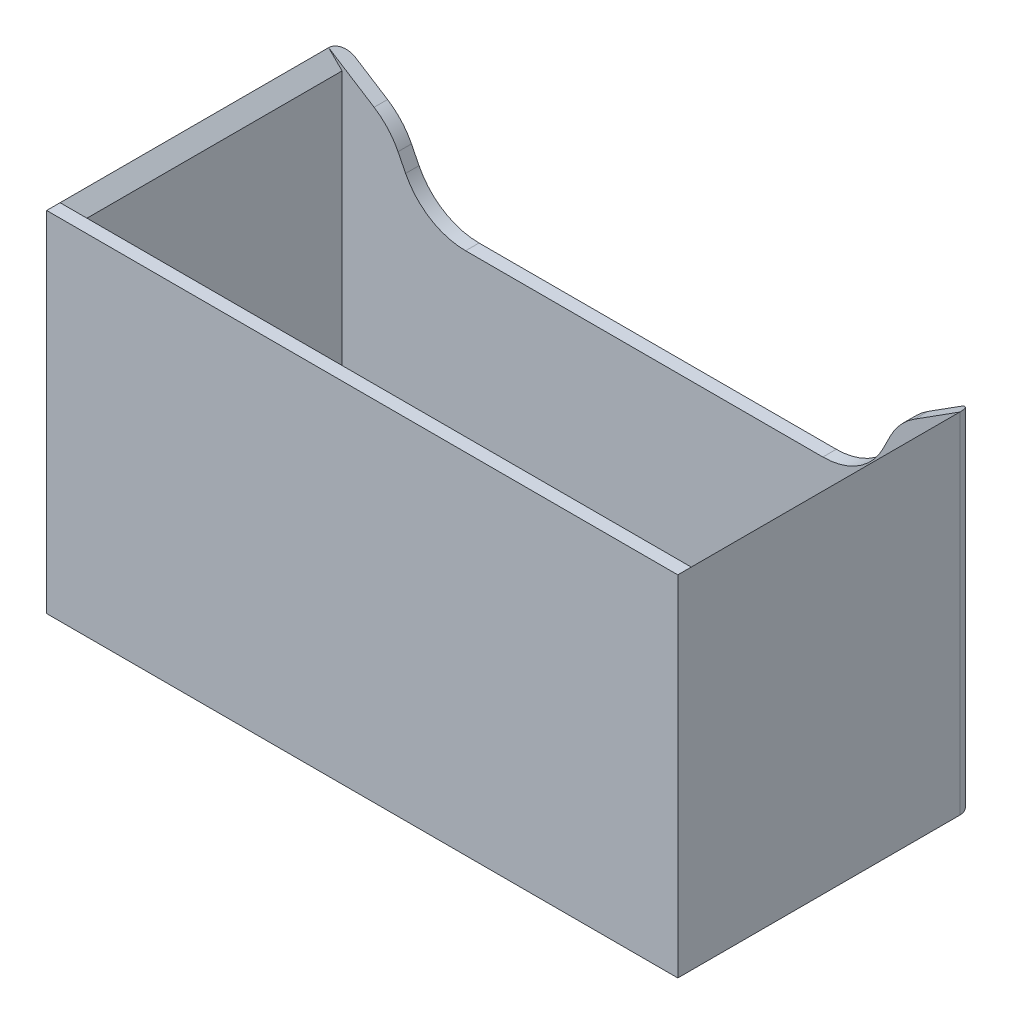
ISO-10303-21;
HEADER;
FILE_DESCRIPTION(('STEP AP214'),'2;1');
FILE_NAME('part.step','',(''),(''),'','','');
FILE_SCHEMA(('AUTOMOTIVE_DESIGN { 1 0 10303 214 1 1 1 1 }'));
ENDSEC;
DATA;
#1=APPLICATION_CONTEXT('core data for automotive mechanical design processes');
#2=APPLICATION_PROTOCOL_DEFINITION('international standard','automotive_design',2000,#1);
#3=PRODUCT_CONTEXT('',#1,'mechanical');
#4=PRODUCT('Part','Part','',(#3));
#5=PRODUCT_RELATED_PRODUCT_CATEGORY('part','',(#4));
#6=PRODUCT_DEFINITION_FORMATION('','',#4);
#7=PRODUCT_DEFINITION_CONTEXT('part definition',#1,'design');
#8=PRODUCT_DEFINITION('design','',#6,#7);
#9=PRODUCT_DEFINITION_SHAPE('','',#8);
#10=(LENGTH_UNIT() NAMED_UNIT(*) SI_UNIT(.MILLI.,.METRE.));
#11=(NAMED_UNIT(*) PLANE_ANGLE_UNIT() SI_UNIT($,.RADIAN.));
#12=(NAMED_UNIT(*) SI_UNIT($,.STERADIAN.) SOLID_ANGLE_UNIT());
#13=UNCERTAINTY_MEASURE_WITH_UNIT(LENGTH_MEASURE(1.E-05),#10,'distance_accuracy_value','');
#14=(GEOMETRIC_REPRESENTATION_CONTEXT(3) GLOBAL_UNCERTAINTY_ASSIGNED_CONTEXT((#13)) GLOBAL_UNIT_ASSIGNED_CONTEXT((#10,
#11,#12)) REPRESENTATION_CONTEXT('',''));
#15=CARTESIAN_POINT('',(0.,0.,0.));
#16=DIRECTION('',(0.,0.,1.));
#17=DIRECTION('',(1.,0.,0.));
#18=AXIS2_PLACEMENT_3D('',#15,#16,#17);
#19=CARTESIAN_POINT('',(22.5,25.,-10.));
#20=DIRECTION('',(0.,-1.,0.));
#21=DIRECTION('',(0.,0.,-1.));
#22=AXIS2_PLACEMENT_3D('',#19,#20,#21);
#23=CYLINDRICAL_SURFACE('',#22,1.);
#24=DIRECTION('',(0.,-1.,0.));
#25=VECTOR('',#24,1.);
#26=CARTESIAN_POINT('',(22.5,25.,-11.));
#27=LINE('',#26,#25);
#28=CARTESIAN_POINT('',(22.5,24.3637077150299,-11.));
#29=VERTEX_POINT('',#28);
#30=CARTESIAN_POINT('',(22.5,-1.,-11.));
#31=VERTEX_POINT('',#30);
#32=EDGE_CURVE('E294',#29,#31,#27,.T.);
#33=ORIENTED_EDGE('',*,*,#32,.F.);
#34=CARTESIAN_POINT('',(22.5,24.3637077150299,-10.));
#35=DIRECTION('',(-0.536832644426927,0.843688752963789,0.));
#36=DIRECTION('',(-0.843688752963789,-0.536832644426927,0.));
#37=AXIS2_PLACEMENT_3D('',#34,#35,#36);
#38=ELLIPSE('',#37,1.18527122293275,1.);
#39=CARTESIAN_POINT('',(23.5,25.,-10.));
#40=VERTEX_POINT('',#39);
#41=EDGE_CURVE('E309',#29,#40,#38,.F.);
#42=ORIENTED_EDGE('',*,*,#41,.T.);
#43=DIRECTION('',(0.,-1.,0.));
#44=VECTOR('',#43,1.);
#45=CARTESIAN_POINT('',(23.5,25.,-10.));
#46=LINE('',#45,#44);
#47=CARTESIAN_POINT('',(23.5,-1.,-10.));
#48=VERTEX_POINT('',#47);
#49=EDGE_CURVE('E300',#48,#40,#46,.F.);
#50=ORIENTED_EDGE('',*,*,#49,.F.);
#51=CARTESIAN_POINT('',(22.5,-1.,-10.));
#52=DIRECTION('',(0.,-1.,0.));
#53=DIRECTION('',(0.,0.,-1.));
#54=AXIS2_PLACEMENT_3D('',#51,#52,#53);
#55=CIRCLE('',#54,1.);
#56=EDGE_CURVE('E298',#31,#48,#55,.T.);
#57=ORIENTED_EDGE('',*,*,#56,.F.);
#58=EDGE_LOOP('',(#33,#42,#50,#57));
#59=FACE_BOUND('',#58,.T.);
#60=ADVANCED_FACE('F35',(#59),#23,.T.);
#61=CARTESIAN_POINT('',(0.,25.,0.));
#62=DIRECTION('',(0.,-1.,0.));
#63=DIRECTION('',(0.,0.,-1.));
#64=AXIS2_PLACEMENT_3D('',#61,#62,#63);
#65=PLANE('',#64);
#66=DIRECTION('',(0.,0.,-1.));
#67=VECTOR('',#66,1.);
#68=CARTESIAN_POINT('',(23.5,25.,0.));
#69=LINE('',#68,#67);
#70=CARTESIAN_POINT('',(23.5,25.,11.));
#71=VERTEX_POINT('',#70);
#72=CARTESIAN_POINT('',(23.5,25.,10.));
#73=VERTEX_POINT('',#72);
#74=EDGE_CURVE('E284',#71,#73,#69,.T.);
#75=ORIENTED_EDGE('',*,*,#74,.T.);
#76=DIRECTION('',(1.,0.,0.));
#77=VECTOR('',#76,1.);
#78=CARTESIAN_POINT('',(-22.5,25.,10.));
#79=LINE('',#78,#77);
#80=CARTESIAN_POINT('',(-23.5,25.,10.));
#81=VERTEX_POINT('',#80);
#82=EDGE_CURVE('E49',#81,#73,#79,.T.);
#83=ORIENTED_EDGE('',*,*,#82,.F.);
#84=DIRECTION('',(0.,0.,1.));
#85=VECTOR('',#84,1.);
#86=CARTESIAN_POINT('',(-23.5,25.,0.));
#87=LINE('',#86,#85);
#88=CARTESIAN_POINT('',(-23.5,25.,11.));
#89=VERTEX_POINT('',#88);
#90=EDGE_CURVE('E287',#81,#89,#87,.T.);
#91=ORIENTED_EDGE('',*,*,#90,.T.);
#92=DIRECTION('',(1.,0.,0.));
#93=VECTOR('',#92,1.);
#94=CARTESIAN_POINT('',(0.,25.,11.));
#95=LINE('',#94,#93);
#96=EDGE_CURVE('E273',#89,#71,#95,.T.);
#97=ORIENTED_EDGE('',*,*,#96,.T.);
#98=EDGE_LOOP('',(#75,#83,#91,#97));
#99=FACE_BOUND('',#98,.T.);
#100=ADVANCED_FACE('F376',(#99),#65,.F.);
#101=CARTESIAN_POINT('',(23.5,25.,10.));
#102=DIRECTION('',(-1.,0.,0.));
#103=DIRECTION('',(0.,0.,1.));
#104=AXIS2_PLACEMENT_3D('',#101,#102,#103);
#105=PLANE('',#104);
#106=DIRECTION('',(0.,0.,-1.));
#107=VECTOR('',#106,1.);
#108=CARTESIAN_POINT('',(23.5,-1.,0.));
#109=LINE('',#108,#107);
#110=CARTESIAN_POINT('',(23.5,-1.,11.));
#111=VERTEX_POINT('',#110);
#112=EDGE_CURVE('E265',#111,#48,#109,.T.);
#113=ORIENTED_EDGE('',*,*,#112,.T.);
#114=ORIENTED_EDGE('',*,*,#49,.T.);
#115=EDGE_CURVE('E283',#73,#40,#69,.T.);
#116=ORIENTED_EDGE('',*,*,#115,.F.);
#117=ORIENTED_EDGE('',*,*,#74,.F.);
#118=DIRECTION('',(0.,-1.,0.));
#119=VECTOR('',#118,1.);
#120=CARTESIAN_POINT('',(23.5,25.,11.));
#121=LINE('',#120,#119);
#122=EDGE_CURVE('E269',#71,#111,#121,.T.);
#123=ORIENTED_EDGE('',*,*,#122,.T.);
#124=EDGE_LOOP('',(#113,#114,#116,#117,#123));
#125=FACE_BOUND('',#124,.T.);
#126=ADVANCED_FACE('F332',(#125),#105,.F.);
#127=CARTESIAN_POINT('',(-22.5,25.,-11.));
#128=DIRECTION('',(0.,0.,1.));
#129=DIRECTION('',(1.,0.,0.));
#130=AXIS2_PLACEMENT_3D('',#127,#128,#129);
#131=PLANE('',#130);
#132=DIRECTION('',(0.,-1.,0.));
#133=VECTOR('',#132,1.);
#134=CARTESIAN_POINT('',(-22.5,25.,-11.));
#135=LINE('',#134,#133);
#136=CARTESIAN_POINT('',(-22.5,-1.,-11.));
#137=VERTEX_POINT('',#136);
#138=CARTESIAN_POINT('',(-22.5,24.3637077150299,-11.));
#139=VERTEX_POINT('',#138);
#140=EDGE_CURVE('E281',#137,#139,#135,.F.);
#141=ORIENTED_EDGE('',*,*,#140,.T.);
#142=DIRECTION('',(0.843688752963789,-0.536832644426927,0.));
#143=VECTOR('',#142,1.);
#144=CARTESIAN_POINT('',(-22.7881892881224,24.5470803356732,-11.));
#145=LINE('',#144,#143);
#146=CARTESIAN_POINT('',(-20.1152547441115,22.8463127070889,-11.));
#147=VERTEX_POINT('',#146);
#148=EDGE_CURVE('E210',#139,#147,#145,.T.);
#149=ORIENTED_EDGE('',*,*,#148,.T.);
#150=CARTESIAN_POINT('',(-22.7994179662461,18.6278689422699,-11.));
#151=DIRECTION('',(0.,0.,1.));
#152=DIRECTION('',(1.,0.,0.));
#153=AXIS2_PLACEMENT_3D('',#150,#151,#152);
#154=CIRCLE('',#153,5.);
#155=CARTESIAN_POINT('',(-18.3325676005108,20.8744770100312,-11.));
#156=VERTEX_POINT('',#155);
#157=EDGE_CURVE('E230',#147,#156,#154,.F.);
#158=ORIENTED_EDGE('',*,*,#157,.T.);
#159=DIRECTION('',(0.449321613552262,-0.893370073147065,0.));
#160=VECTOR('',#159,1.);
#161=CARTESIAN_POINT('',(-20.8299583376628,25.8399495763021,-11.));
#162=LINE('',#161,#160);
#163=CARTESIAN_POINT('',(-17.7687164359999,19.7533919322387,-11.));
#164=VERTEX_POINT('',#163);
#165=EDGE_CURVE('E233',#156,#164,#162,.T.);
#166=ORIENTED_EDGE('',*,*,#165,.T.);
#167=CARTESIAN_POINT('',(-13.3018660702646,22.,-11.));
#168=DIRECTION('',(0.,0.,1.));
#169=DIRECTION('',(1.,0.,0.));
#170=AXIS2_PLACEMENT_3D('',#167,#168,#169);
#171=CIRCLE('',#170,5.);
#172=CARTESIAN_POINT('',(-13.3018660702646,17.,-11.));
#173=VERTEX_POINT('',#172);
#174=EDGE_CURVE('E236',#164,#173,#171,.T.);
#175=ORIENTED_EDGE('',*,*,#174,.T.);
#176=DIRECTION('',(1.,0.,0.));
#177=VECTOR('',#176,1.);
#178=CARTESIAN_POINT('',(-22.5,17.,-11.));
#179=LINE('',#178,#177);
#180=CARTESIAN_POINT('',(13.3018660702646,17.,-11.));
#181=VERTEX_POINT('',#180);
#182=EDGE_CURVE('E239',#173,#181,#179,.T.);
#183=ORIENTED_EDGE('',*,*,#182,.T.);
#184=CARTESIAN_POINT('',(13.3018660702646,22.,-11.));
#185=DIRECTION('',(0.,0.,1.));
#186=DIRECTION('',(1.,0.,0.));
#187=AXIS2_PLACEMENT_3D('',#184,#185,#186);
#188=CIRCLE('',#187,5.);
#189=CARTESIAN_POINT('',(17.768716436,19.7533919322387,-11.));
#190=VERTEX_POINT('',#189);
#191=EDGE_CURVE('E242',#190,#181,#188,.F.);
#192=ORIENTED_EDGE('',*,*,#191,.F.);
#193=DIRECTION('',(-0.449321613552262,-0.893370073147065,0.));
#194=VECTOR('',#193,1.);
#195=CARTESIAN_POINT('',(11.7449122794284,7.77647785184372,-11.));
#196=LINE('',#195,#194);
#197=CARTESIAN_POINT('',(18.3325676005108,20.8744770100312,-11.));
#198=VERTEX_POINT('',#197);
#199=EDGE_CURVE('E173',#198,#190,#196,.T.);
#200=ORIENTED_EDGE('',*,*,#199,.F.);
#201=CARTESIAN_POINT('',(22.7994179662461,18.6278689422699,-11.));
#202=DIRECTION('',(0.,0.,1.));
#203=DIRECTION('',(1.,0.,0.));
#204=AXIS2_PLACEMENT_3D('',#201,#202,#203);
#205=CIRCLE('',#204,5.);
#206=CARTESIAN_POINT('',(20.1152547441115,22.8463127070889,-11.));
#207=VERTEX_POINT('',#206);
#208=EDGE_CURVE('E228',#207,#198,#205,.T.);
#209=ORIENTED_EDGE('',*,*,#208,.F.);
#210=DIRECTION('',(-0.843688752963789,-0.536832644426927,0.));
#211=VECTOR('',#210,1.);
#212=CARTESIAN_POINT('',(-9.24329274636927,4.16569544096689,-11.));
#213=LINE('',#212,#211);
#214=EDGE_CURVE('E225',#29,#207,#213,.T.);
#215=ORIENTED_EDGE('',*,*,#214,.F.);
#216=ORIENTED_EDGE('',*,*,#32,.T.);
#217=DIRECTION('',(-1.,0.,0.));
#218=VECTOR('',#217,1.);
#219=CARTESIAN_POINT('',(0.,-1.,-11.));
#220=LINE('',#219,#218);
#221=EDGE_CURVE('E268',#31,#137,#220,.T.);
#222=ORIENTED_EDGE('',*,*,#221,.T.);
#223=EDGE_LOOP('',(#141,#149,#158,#166,#175,#183,#192,#200,#209,#215,#216,#222));
#224=FACE_BOUND('',#223,.T.);
#225=ADVANCED_FACE('F369',(#224),#131,.F.);
#226=CARTESIAN_POINT('',(-23.5,25.,10.));
#227=DIRECTION('',(1.,0.,0.));
#228=DIRECTION('',(0.,0.,-1.));
#229=AXIS2_PLACEMENT_3D('',#226,#227,#228);
#230=PLANE('',#229);
#231=CARTESIAN_POINT('',(-23.5,25.,-10.));
#232=VERTEX_POINT('',#231);
#233=EDGE_CURVE('E288',#232,#81,#87,.T.);
#234=ORIENTED_EDGE('',*,*,#233,.F.);
#235=DIRECTION('',(0.,-1.,0.));
#236=VECTOR('',#235,1.);
#237=CARTESIAN_POINT('',(-23.5,25.,-10.));
#238=LINE('',#237,#236);
#239=CARTESIAN_POINT('',(-23.5,-1.,-10.));
#240=VERTEX_POINT('',#239);
#241=EDGE_CURVE('E303',#232,#240,#238,.T.);
#242=ORIENTED_EDGE('',*,*,#241,.T.);
#243=DIRECTION('',(0.,0.,1.));
#244=VECTOR('',#243,1.);
#245=CARTESIAN_POINT('',(-23.5,-1.,0.));
#246=LINE('',#245,#244);
#247=CARTESIAN_POINT('',(-23.5,-1.,11.));
#248=VERTEX_POINT('',#247);
#249=EDGE_CURVE('E276',#240,#248,#246,.T.);
#250=ORIENTED_EDGE('',*,*,#249,.T.);
#251=DIRECTION('',(0.,-1.,0.));
#252=VECTOR('',#251,1.);
#253=CARTESIAN_POINT('',(-23.5,25.,11.));
#254=LINE('',#253,#252);
#255=EDGE_CURVE('E272',#89,#248,#254,.T.);
#256=ORIENTED_EDGE('',*,*,#255,.F.);
#257=ORIENTED_EDGE('',*,*,#90,.F.);
#258=EDGE_LOOP('',(#234,#242,#250,#256,#257));
#259=FACE_BOUND('',#258,.T.);
#260=ADVANCED_FACE('F357',(#259),#230,.F.);
#261=CARTESIAN_POINT('',(-22.5,25.,11.));
#262=DIRECTION('',(0.,0.,-1.));
#263=DIRECTION('',(-1.,0.,0.));
#264=AXIS2_PLACEMENT_3D('',#261,#262,#263);
#265=PLANE('',#264);
#266=DIRECTION('',(1.,0.,0.));
#267=VECTOR('',#266,1.);
#268=CARTESIAN_POINT('',(0.,-1.,11.));
#269=LINE('',#268,#267);
#270=EDGE_CURVE('E278',#248,#111,#269,.T.);
#271=ORIENTED_EDGE('',*,*,#270,.T.);
#272=ORIENTED_EDGE('',*,*,#122,.F.);
#273=ORIENTED_EDGE('',*,*,#96,.F.);
#274=ORIENTED_EDGE('',*,*,#255,.T.);
#275=EDGE_LOOP('',(#271,#272,#273,#274));
#276=FACE_BOUND('',#275,.T.);
#277=ADVANCED_FACE('F373',(#276),#265,.F.);
#278=CARTESIAN_POINT('',(0.,-1.,0.));
#279=DIRECTION('',(0.,-1.,0.));
#280=DIRECTION('',(0.,0.,-1.));
#281=AXIS2_PLACEMENT_3D('',#278,#279,#280);
#282=PLANE('',#281);
#283=ORIENTED_EDGE('',*,*,#221,.F.);
#284=ORIENTED_EDGE('',*,*,#56,.T.);
#285=ORIENTED_EDGE('',*,*,#112,.F.);
#286=ORIENTED_EDGE('',*,*,#270,.F.);
#287=ORIENTED_EDGE('',*,*,#249,.F.);
#288=CARTESIAN_POINT('',(-22.5,-1.,-10.));
#289=DIRECTION('',(0.,-1.,0.));
#290=DIRECTION('',(0.,0.,-1.));
#291=AXIS2_PLACEMENT_3D('',#288,#289,#290);
#292=CIRCLE('',#291,1.);
#293=EDGE_CURVE('E296',#240,#137,#292,.T.);
#294=ORIENTED_EDGE('',*,*,#293,.T.);
#295=EDGE_LOOP('',(#283,#284,#285,#286,#287,#294));
#296=FACE_BOUND('',#295,.T.);
#297=ADVANCED_FACE('F366',(#296),#282,.T.);
#298=CARTESIAN_POINT('',(22.5,25.,10.));
#299=DIRECTION('',(-1.,0.,0.));
#300=DIRECTION('',(0.,0.,1.));
#301=AXIS2_PLACEMENT_3D('',#298,#299,#300);
#302=PLANE('',#301);
#303=DIRECTION('',(0.,-1.,0.));
#304=VECTOR('',#303,1.);
#305=CARTESIAN_POINT('',(22.5,25.,10.));
#306=LINE('',#305,#304);
#307=CARTESIAN_POINT('',(22.5,24.,10.));
#308=VERTEX_POINT('',#307);
#309=CARTESIAN_POINT('',(22.5,0.,10.));
#310=VERTEX_POINT('',#309);
#311=EDGE_CURVE('E246',#308,#310,#306,.T.);
#312=ORIENTED_EDGE('',*,*,#311,.F.);
#313=DIRECTION('',(0.,0.,-1.));
#314=VECTOR('',#313,1.);
#315=CARTESIAN_POINT('',(22.5,24.,-10.));
#316=LINE('',#315,#314);
#317=CARTESIAN_POINT('',(22.5,24.,-10.));
#318=VERTEX_POINT('',#317);
#319=EDGE_CURVE('E319',#308,#318,#316,.T.);
#320=ORIENTED_EDGE('',*,*,#319,.T.);
#321=DIRECTION('',(0.,-1.,0.));
#322=VECTOR('',#321,1.);
#323=CARTESIAN_POINT('',(22.5,25.,-10.));
#324=LINE('',#323,#322);
#325=CARTESIAN_POINT('',(22.5,0.,-10.));
#326=VERTEX_POINT('',#325);
#327=EDGE_CURVE('E263',#318,#326,#324,.T.);
#328=ORIENTED_EDGE('',*,*,#327,.T.);
#329=DIRECTION('',(0.,0.,-1.));
#330=VECTOR('',#329,1.);
#331=CARTESIAN_POINT('',(22.5,0.,10.));
#332=LINE('',#331,#330);
#333=EDGE_CURVE('E244',#310,#326,#332,.T.);
#334=ORIENTED_EDGE('',*,*,#333,.F.);
#335=EDGE_LOOP('',(#312,#320,#328,#334));
#336=FACE_BOUND('',#335,.T.);
#337=ADVANCED_FACE('F341',(#336),#302,.T.);
#338=CARTESIAN_POINT('',(-22.5,25.,-10.));
#339=DIRECTION('',(0.,0.,1.));
#340=DIRECTION('',(1.,0.,0.));
#341=AXIS2_PLACEMENT_3D('',#338,#339,#340);
#342=PLANE('',#341);
#343=DIRECTION('',(0.843688752963789,-0.536832644426927,0.));
#344=VECTOR('',#343,1.);
#345=CARTESIAN_POINT('',(4.55054333729361,7.15165568525987,-10.));
#346=LINE('',#345,#344);
#347=CARTESIAN_POINT('',(-20.1152547441115,22.8463127070889,-10.));
#348=VERTEX_POINT('',#347);
#349=EDGE_CURVE('E196',#232,#348,#346,.T.);
#350=ORIENTED_EDGE('',*,*,#349,.F.);
#351=DIRECTION('',(0.70710678118655,-0.707106781186545,0.));
#352=VECTOR('',#351,1.);
#353=CARTESIAN_POINT('',(-22.5,24.,-10.));
#354=LINE('',#353,#352);
#355=CARTESIAN_POINT('',(-22.5,24.,-10.));
#356=VERTEX_POINT('',#355);
#357=EDGE_CURVE('E317',#232,#356,#354,.T.);
#358=ORIENTED_EDGE('',*,*,#357,.T.);
#359=DIRECTION('',(0.,-1.,0.));
#360=VECTOR('',#359,1.);
#361=CARTESIAN_POINT('',(-22.5,25.,-10.));
#362=LINE('',#361,#360);
#363=CARTESIAN_POINT('',(-22.5,0.,-10.));
#364=VERTEX_POINT('',#363);
#365=EDGE_CURVE('E261',#356,#364,#362,.T.);
#366=ORIENTED_EDGE('',*,*,#365,.T.);
#367=DIRECTION('',(-1.,0.,0.));
#368=VECTOR('',#367,1.);
#369=CARTESIAN_POINT('',(-22.5,0.,-10.));
#370=LINE('',#369,#368);
#371=EDGE_CURVE('E250',#326,#364,#370,.T.);
#372=ORIENTED_EDGE('',*,*,#371,.F.);
#373=ORIENTED_EDGE('',*,*,#327,.F.);
#374=DIRECTION('',(0.70710678118655,0.707106781186545,0.));
#375=VECTOR('',#374,1.);
#376=CARTESIAN_POINT('',(22.5,24.,-10.));
#377=LINE('',#376,#375);
#378=EDGE_CURVE('E43',#318,#40,#377,.T.);
#379=ORIENTED_EDGE('',*,*,#378,.T.);
#380=DIRECTION('',(-0.843688752963789,-0.536832644426927,0.));
#381=VECTOR('',#380,1.);
#382=CARTESIAN_POINT('',(-4.5505433372936,7.15165568525986,-10.));
#383=LINE('',#382,#381);
#384=CARTESIAN_POINT('',(20.1152547441115,22.8463127070889,-10.));
#385=VERTEX_POINT('',#384);
#386=EDGE_CURVE('E192',#40,#385,#383,.T.);
#387=ORIENTED_EDGE('',*,*,#386,.T.);
#388=CARTESIAN_POINT('',(22.7994179662461,18.6278689422699,-10.));
#389=DIRECTION('',(0.,0.,1.));
#390=DIRECTION('',(1.,0.,0.));
#391=AXIS2_PLACEMENT_3D('',#388,#389,#390);
#392=CIRCLE('',#391,5.);
#393=CARTESIAN_POINT('',(18.3325676005108,20.8744770100312,-10.));
#394=VERTEX_POINT('',#393);
#395=EDGE_CURVE('E190',#385,#394,#392,.T.);
#396=ORIENTED_EDGE('',*,*,#395,.T.);
#397=DIRECTION('',(-0.449321613552262,-0.893370073147065,0.));
#398=VECTOR('',#397,1.);
#399=CARTESIAN_POINT('',(6.25217323940208,-3.14453847579688,-10.));
#400=LINE('',#399,#398);
#401=CARTESIAN_POINT('',(17.768716436,19.7533919322387,-10.));
#402=VERTEX_POINT('',#401);
#403=EDGE_CURVE('E170',#394,#402,#400,.T.);
#404=ORIENTED_EDGE('',*,*,#403,.T.);
#405=CARTESIAN_POINT('',(13.3018660702646,22.,-10.));
#406=DIRECTION('',(0.,0.,1.));
#407=DIRECTION('',(1.,0.,0.));
#408=AXIS2_PLACEMENT_3D('',#405,#406,#407);
#409=CIRCLE('',#408,5.);
#410=CARTESIAN_POINT('',(13.3018660702646,17.,-10.));
#411=VERTEX_POINT('',#410);
#412=EDGE_CURVE('E180',#402,#411,#409,.F.);
#413=ORIENTED_EDGE('',*,*,#412,.T.);
#414=DIRECTION('',(1.,0.,0.));
#415=VECTOR('',#414,1.);
#416=CARTESIAN_POINT('',(0.,17.,-10.));
#417=LINE('',#416,#415);
#418=CARTESIAN_POINT('',(-13.3018660702646,17.,-10.));
#419=VERTEX_POINT('',#418);
#420=EDGE_CURVE('E177',#419,#411,#417,.T.);
#421=ORIENTED_EDGE('',*,*,#420,.F.);
#422=CARTESIAN_POINT('',(-13.3018660702646,22.,-10.));
#423=DIRECTION('',(0.,0.,1.));
#424=DIRECTION('',(1.,0.,0.));
#425=AXIS2_PLACEMENT_3D('',#422,#423,#424);
#426=CIRCLE('',#425,5.);
#427=CARTESIAN_POINT('',(-17.7687164359999,19.7533919322387,-10.));
#428=VERTEX_POINT('',#427);
#429=EDGE_CURVE('E205',#428,#419,#426,.T.);
#430=ORIENTED_EDGE('',*,*,#429,.F.);
#431=DIRECTION('',(0.449321613552262,-0.893370073147065,0.));
#432=VECTOR('',#431,1.);
#433=CARTESIAN_POINT('',(-6.25217323940207,-3.14453847579687,-10.));
#434=LINE('',#433,#432);
#435=CARTESIAN_POINT('',(-18.3325676005108,20.8744770100312,-10.));
#436=VERTEX_POINT('',#435);
#437=EDGE_CURVE('E202',#436,#428,#434,.T.);
#438=ORIENTED_EDGE('',*,*,#437,.F.);
#439=CARTESIAN_POINT('',(-22.7994179662461,18.6278689422699,-10.));
#440=DIRECTION('',(0.,0.,1.));
#441=DIRECTION('',(1.,0.,0.));
#442=AXIS2_PLACEMENT_3D('',#439,#440,#441);
#443=CIRCLE('',#442,5.);
#444=EDGE_CURVE('E199',#348,#436,#443,.F.);
#445=ORIENTED_EDGE('',*,*,#444,.F.);
#446=EDGE_LOOP('',(#350,#358,#366,#372,#373,#379,#387,#396,#404,#413,#421,#430,#438,#445));
#447=FACE_BOUND('',#446,.T.);
#448=ADVANCED_FACE('F188',(#447),#342,.T.);
#449=CARTESIAN_POINT('',(-22.5,25.,10.));
#450=DIRECTION('',(1.,0.,0.));
#451=DIRECTION('',(0.,0.,-1.));
#452=AXIS2_PLACEMENT_3D('',#449,#450,#451);
#453=PLANE('',#452);
#454=ORIENTED_EDGE('',*,*,#365,.F.);
#455=DIRECTION('',(0.,0.,1.));
#456=VECTOR('',#455,1.);
#457=CARTESIAN_POINT('',(-22.5,24.,10.));
#458=LINE('',#457,#456);
#459=CARTESIAN_POINT('',(-22.5,24.,10.));
#460=VERTEX_POINT('',#459);
#461=EDGE_CURVE('E312',#356,#460,#458,.T.);
#462=ORIENTED_EDGE('',*,*,#461,.T.);
#463=DIRECTION('',(0.,-1.,0.));
#464=VECTOR('',#463,1.);
#465=CARTESIAN_POINT('',(-22.5,25.,10.));
#466=LINE('',#465,#464);
#467=CARTESIAN_POINT('',(-22.5,0.,10.));
#468=VERTEX_POINT('',#467);
#469=EDGE_CURVE('E259',#460,#468,#466,.T.);
#470=ORIENTED_EDGE('',*,*,#469,.T.);
#471=DIRECTION('',(0.,0.,1.));
#472=VECTOR('',#471,1.);
#473=CARTESIAN_POINT('',(-22.5,0.,10.));
#474=LINE('',#473,#472);
#475=EDGE_CURVE('E253',#364,#468,#474,.T.);
#476=ORIENTED_EDGE('',*,*,#475,.F.);
#477=EDGE_LOOP('',(#454,#462,#470,#476));
#478=FACE_BOUND('',#477,.T.);
#479=ADVANCED_FACE('F349',(#478),#453,.T.);
#480=CARTESIAN_POINT('',(-22.5,25.,10.));
#481=DIRECTION('',(0.,0.,-1.));
#482=DIRECTION('',(-1.,0.,0.));
#483=AXIS2_PLACEMENT_3D('',#480,#481,#482);
#484=PLANE('',#483);
#485=DIRECTION('',(1.,0.,0.));
#486=VECTOR('',#485,1.);
#487=CARTESIAN_POINT('',(-22.5,0.,10.));
#488=LINE('',#487,#486);
#489=EDGE_CURVE('E247',#468,#310,#488,.T.);
#490=ORIENTED_EDGE('',*,*,#489,.F.);
#491=ORIENTED_EDGE('',*,*,#469,.F.);
#492=DIRECTION('',(-0.70710678118655,0.707106781186545,0.));
#493=VECTOR('',#492,1.);
#494=CARTESIAN_POINT('',(-22.5,24.,10.));
#495=LINE('',#494,#493);
#496=EDGE_CURVE('E315',#460,#81,#495,.T.);
#497=ORIENTED_EDGE('',*,*,#496,.T.);
#498=ORIENTED_EDGE('',*,*,#82,.T.);
#499=DIRECTION('',(-0.70710678118655,-0.707106781186545,0.));
#500=VECTOR('',#499,1.);
#501=CARTESIAN_POINT('',(22.5,24.,10.));
#502=LINE('',#501,#500);
#503=EDGE_CURVE('E11',#73,#308,#502,.T.);
#504=ORIENTED_EDGE('',*,*,#503,.T.);
#505=ORIENTED_EDGE('',*,*,#311,.T.);
#506=EDGE_LOOP('',(#490,#491,#497,#498,#504,#505));
#507=FACE_BOUND('',#506,.T.);
#508=ADVANCED_FACE('F338',(#507),#484,.T.);
#509=CARTESIAN_POINT('',(0.,0.,0.));
#510=DIRECTION('',(0.,-1.,0.));
#511=DIRECTION('',(0.,0.,-1.));
#512=AXIS2_PLACEMENT_3D('',#509,#510,#511);
#513=PLANE('',#512);
#514=ORIENTED_EDGE('',*,*,#333,.T.);
#515=ORIENTED_EDGE('',*,*,#371,.T.);
#516=ORIENTED_EDGE('',*,*,#475,.T.);
#517=ORIENTED_EDGE('',*,*,#489,.T.);
#518=EDGE_LOOP('',(#514,#515,#516,#517));
#519=FACE_BOUND('',#518,.T.);
#520=ADVANCED_FACE('F343',(#519),#513,.F.);
#521=CARTESIAN_POINT('',(-22.5,25.,-10.));
#522=DIRECTION('',(0.,-1.,0.));
#523=DIRECTION('',(0.,0.,-1.));
#524=AXIS2_PLACEMENT_3D('',#521,#522,#523);
#525=CYLINDRICAL_SURFACE('',#524,1.);
#526=CARTESIAN_POINT('',(-22.5,24.3637077150299,-10.));
#527=DIRECTION('',(-0.536832644426927,-0.843688752963789,0.));
#528=DIRECTION('',(0.843688752963789,-0.536832644426927,0.));
#529=AXIS2_PLACEMENT_3D('',#526,#527,#528);
#530=ELLIPSE('',#529,1.18527122293275,1.);
#531=EDGE_CURVE('E306',#139,#232,#530,.F.);
#532=ORIENTED_EDGE('',*,*,#531,.F.);
#533=ORIENTED_EDGE('',*,*,#140,.F.);
#534=ORIENTED_EDGE('',*,*,#293,.F.);
#535=ORIENTED_EDGE('',*,*,#241,.F.);
#536=EDGE_LOOP('',(#532,#533,#534,#535));
#537=FACE_BOUND('',#536,.T.);
#538=ADVANCED_FACE('F362',(#537),#525,.T.);
#539=CARTESIAN_POINT('',(13.3018660702646,22.,-15.));
#540=DIRECTION('',(0.,0.,1.));
#541=DIRECTION('',(1.,0.,0.));
#542=AXIS2_PLACEMENT_3D('',#539,#540,#541);
#543=CYLINDRICAL_SURFACE('',#542,5.);
#544=ORIENTED_EDGE('',*,*,#191,.T.);
#545=DIRECTION('',(0.,0.,1.));
#546=VECTOR('',#545,1.);
#547=CARTESIAN_POINT('',(13.3018660702646,17.,-15.));
#548=LINE('',#547,#546);
#549=EDGE_CURVE('E183',#181,#411,#548,.T.);
#550=ORIENTED_EDGE('',*,*,#549,.T.);
#551=ORIENTED_EDGE('',*,*,#412,.F.);
#552=DIRECTION('',(0.,0.,1.));
#553=VECTOR('',#552,1.);
#554=CARTESIAN_POINT('',(17.768716436,19.7533919322387,-15.));
#555=LINE('',#554,#553);
#556=EDGE_CURVE('E165',#190,#402,#555,.T.);
#557=ORIENTED_EDGE('',*,*,#556,.F.);
#558=EDGE_LOOP('',(#544,#550,#551,#557));
#559=FACE_BOUND('',#558,.T.);
#560=ADVANCED_FACE('F181',(#559),#543,.F.);
#561=CARTESIAN_POINT('',(0.,17.,-15.));
#562=DIRECTION('',(0.,-1.,0.));
#563=DIRECTION('',(0.,0.,-1.));
#564=AXIS2_PLACEMENT_3D('',#561,#562,#563);
#565=PLANE('',#564);
#566=DIRECTION('',(0.,0.,1.));
#567=VECTOR('',#566,1.);
#568=CARTESIAN_POINT('',(-13.3018660702646,17.,-15.));
#569=LINE('',#568,#567);
#570=EDGE_CURVE('E211',#173,#419,#569,.T.);
#571=ORIENTED_EDGE('',*,*,#570,.T.);
#572=ORIENTED_EDGE('',*,*,#420,.T.);
#573=ORIENTED_EDGE('',*,*,#549,.F.);
#574=ORIENTED_EDGE('',*,*,#182,.F.);
#575=EDGE_LOOP('',(#571,#572,#573,#574));
#576=FACE_BOUND('',#575,.T.);
#577=ADVANCED_FACE('F421',(#576),#565,.F.);
#578=CARTESIAN_POINT('',(-13.3018660702646,22.,-15.));
#579=DIRECTION('',(0.,0.,1.));
#580=DIRECTION('',(1.,0.,0.));
#581=AXIS2_PLACEMENT_3D('',#578,#579,#580);
#582=CYLINDRICAL_SURFACE('',#581,5.);
#583=DIRECTION('',(0.,0.,1.));
#584=VECTOR('',#583,1.);
#585=CARTESIAN_POINT('',(-17.7687164359999,19.7533919322387,-15.));
#586=LINE('',#585,#584);
#587=EDGE_CURVE('E213',#164,#428,#586,.T.);
#588=ORIENTED_EDGE('',*,*,#587,.T.);
#589=ORIENTED_EDGE('',*,*,#429,.T.);
#590=ORIENTED_EDGE('',*,*,#570,.F.);
#591=ORIENTED_EDGE('',*,*,#174,.F.);
#592=EDGE_LOOP('',(#588,#589,#590,#591));
#593=FACE_BOUND('',#592,.T.);
#594=ADVANCED_FACE('F534',(#593),#582,.F.);
#595=CARTESIAN_POINT('',(-6.25217323940207,-3.14453847579687,-15.));
#596=DIRECTION('',(-0.893370073147064,-0.449321613552262,0.));
#597=DIRECTION('',(0.449321613552262,-0.893370073147065,0.));
#598=AXIS2_PLACEMENT_3D('',#595,#596,#597);
#599=PLANE('',#598);
#600=DIRECTION('',(0.,0.,1.));
#601=VECTOR('',#600,1.);
#602=CARTESIAN_POINT('',(-18.3325676005108,20.8744770100312,-15.));
#603=LINE('',#602,#601);
#604=EDGE_CURVE('E215',#156,#436,#603,.T.);
#605=ORIENTED_EDGE('',*,*,#604,.T.);
#606=ORIENTED_EDGE('',*,*,#437,.T.);
#607=ORIENTED_EDGE('',*,*,#587,.F.);
#608=ORIENTED_EDGE('',*,*,#165,.F.);
#609=EDGE_LOOP('',(#605,#606,#607,#608));
#610=FACE_BOUND('',#609,.T.);
#611=ADVANCED_FACE('F527',(#610),#599,.F.);
#612=CARTESIAN_POINT('',(-22.7994179662461,18.6278689422699,-15.));
#613=DIRECTION('',(0.,0.,1.));
#614=DIRECTION('',(1.,0.,0.));
#615=AXIS2_PLACEMENT_3D('',#612,#613,#614);
#616=CYLINDRICAL_SURFACE('',#615,5.);
#617=DIRECTION('',(0.,0.,1.));
#618=VECTOR('',#617,1.);
#619=CARTESIAN_POINT('',(-20.1152547441115,22.8463127070889,-15.));
#620=LINE('',#619,#618);
#621=EDGE_CURVE('E217',#147,#348,#620,.T.);
#622=ORIENTED_EDGE('',*,*,#621,.T.);
#623=ORIENTED_EDGE('',*,*,#444,.T.);
#624=ORIENTED_EDGE('',*,*,#604,.F.);
#625=ORIENTED_EDGE('',*,*,#157,.F.);
#626=EDGE_LOOP('',(#622,#623,#624,#625));
#627=FACE_BOUND('',#626,.T.);
#628=ADVANCED_FACE('F410',(#627),#616,.T.);
#629=CARTESIAN_POINT('',(22.7994179662461,18.6278689422699,-15.));
#630=DIRECTION('',(0.,0.,1.));
#631=DIRECTION('',(1.,0.,0.));
#632=AXIS2_PLACEMENT_3D('',#629,#630,#631);
#633=CYLINDRICAL_SURFACE('',#632,5.);
#634=ORIENTED_EDGE('',*,*,#208,.T.);
#635=DIRECTION('',(0.,0.,1.));
#636=VECTOR('',#635,1.);
#637=CARTESIAN_POINT('',(18.3325676005108,20.8744770100312,-15.));
#638=LINE('',#637,#636);
#639=EDGE_CURVE('E176',#198,#394,#638,.T.);
#640=ORIENTED_EDGE('',*,*,#639,.T.);
#641=ORIENTED_EDGE('',*,*,#395,.F.);
#642=DIRECTION('',(0.,0.,1.));
#643=VECTOR('',#642,1.);
#644=CARTESIAN_POINT('',(20.1152547441115,22.8463127070889,-15.));
#645=LINE('',#644,#643);
#646=EDGE_CURVE('E219',#207,#385,#645,.T.);
#647=ORIENTED_EDGE('',*,*,#646,.F.);
#648=EDGE_LOOP('',(#634,#640,#641,#647));
#649=FACE_BOUND('',#648,.T.);
#650=ADVANCED_FACE('F413',(#649),#633,.T.);
#651=CARTESIAN_POINT('',(6.25217323940208,-3.14453847579688,-15.));
#652=DIRECTION('',(-0.893370073147064,0.449321613552262,0.));
#653=DIRECTION('',(-0.449321613552262,-0.893370073147065,0.));
#654=AXIS2_PLACEMENT_3D('',#651,#652,#653);
#655=PLANE('',#654);
#656=ORIENTED_EDGE('',*,*,#199,.T.);
#657=ORIENTED_EDGE('',*,*,#556,.T.);
#658=ORIENTED_EDGE('',*,*,#403,.F.);
#659=ORIENTED_EDGE('',*,*,#639,.F.);
#660=EDGE_LOOP('',(#656,#657,#658,#659));
#661=FACE_BOUND('',#660,.T.);
#662=ADVANCED_FACE('F167',(#661),#655,.T.);
#663=CARTESIAN_POINT('',(-4.5505433372936,7.15165568525986,-15.));
#664=DIRECTION('',(-0.536832644426927,0.843688752963789,0.));
#665=DIRECTION('',(-0.843688752963789,-0.536832644426927,0.));
#666=AXIS2_PLACEMENT_3D('',#663,#664,#665);
#667=PLANE('',#666);
#668=ORIENTED_EDGE('',*,*,#214,.T.);
#669=ORIENTED_EDGE('',*,*,#646,.T.);
#670=ORIENTED_EDGE('',*,*,#386,.F.);
#671=ORIENTED_EDGE('',*,*,#41,.F.);
#672=EDGE_LOOP('',(#668,#669,#670,#671));
#673=FACE_BOUND('',#672,.T.);
#674=ADVANCED_FACE('F324',(#673),#667,.T.);
#675=CARTESIAN_POINT('',(4.55054333729361,7.15165568525987,-15.));
#676=DIRECTION('',(-0.536832644426927,-0.843688752963789,0.));
#677=DIRECTION('',(0.843688752963789,-0.536832644426927,0.));
#678=AXIS2_PLACEMENT_3D('',#675,#676,#677);
#679=PLANE('',#678);
#680=ORIENTED_EDGE('',*,*,#531,.T.);
#681=ORIENTED_EDGE('',*,*,#349,.T.);
#682=ORIENTED_EDGE('',*,*,#621,.F.);
#683=ORIENTED_EDGE('',*,*,#148,.F.);
#684=EDGE_LOOP('',(#680,#681,#682,#683));
#685=FACE_BOUND('',#684,.T.);
#686=ADVANCED_FACE('F398',(#685),#679,.F.);
#687=CARTESIAN_POINT('',(-22.5,24.,10.));
#688=DIRECTION('',(0.707106781186545,0.70710678118655,0.));
#689=DIRECTION('',(0.,0.,-1.));
#690=AXIS2_PLACEMENT_3D('',#687,#688,#689);
#691=PLANE('',#690);
#692=ORIENTED_EDGE('',*,*,#357,.F.);
#693=ORIENTED_EDGE('',*,*,#233,.T.);
#694=ORIENTED_EDGE('',*,*,#496,.F.);
#695=ORIENTED_EDGE('',*,*,#461,.F.);
#696=EDGE_LOOP('',(#692,#693,#694,#695));
#697=FACE_BOUND('',#696,.T.);
#698=ADVANCED_FACE('F353',(#697),#691,.T.);
#699=CARTESIAN_POINT('',(22.5,24.,10.));
#700=DIRECTION('',(-0.707106781186545,0.70710678118655,0.));
#701=DIRECTION('',(0.,0.,1.));
#702=AXIS2_PLACEMENT_3D('',#699,#700,#701);
#703=PLANE('',#702);
#704=ORIENTED_EDGE('',*,*,#503,.F.);
#705=ORIENTED_EDGE('',*,*,#115,.T.);
#706=ORIENTED_EDGE('',*,*,#378,.F.);
#707=ORIENTED_EDGE('',*,*,#319,.F.);
#708=EDGE_LOOP('',(#704,#705,#706,#707));
#709=FACE_BOUND('',#708,.T.);
#710=ADVANCED_FACE('F37',(#709),#703,.T.);
#711=CLOSED_SHELL('',(#60,#100,#126,#225,#260,#277,#297,#337,#448,#479,#508,#520,#538,#560,#577,
#594,#611,#628,#650,#662,#674,#686,#698,#710));
#712=MANIFOLD_SOLID_BREP('B2',#711);
#713=ADVANCED_BREP_SHAPE_REPRESENTATION('',(#18,#712),#14);
#714=SHAPE_DEFINITION_REPRESENTATION(#9,#713);
ENDSEC;
END-ISO-10303-21;
